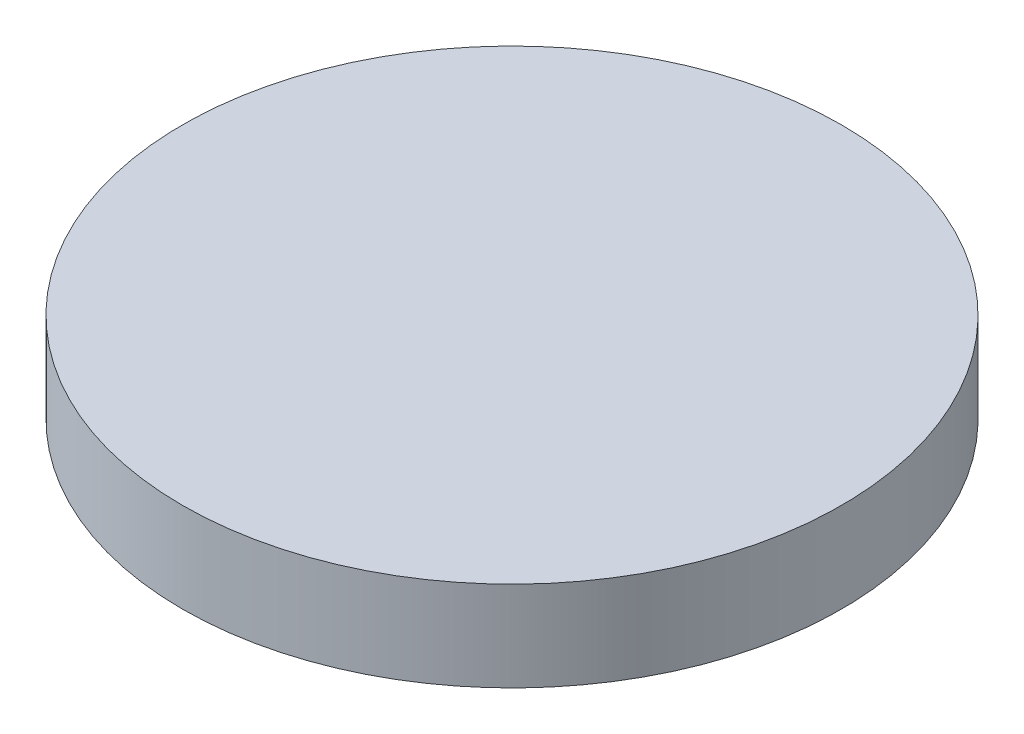
ISO-10303-21;
HEADER;
FILE_DESCRIPTION(('STEP AP214'),'2;1');
FILE_NAME('part.step','',(''),(''),'','','');
FILE_SCHEMA(('AUTOMOTIVE_DESIGN { 1 0 10303 214 1 1 1 1 }'));
ENDSEC;
DATA;
#1=APPLICATION_CONTEXT('core data for automotive mechanical design processes');
#2=APPLICATION_PROTOCOL_DEFINITION('international standard','automotive_design',2000,#1);
#3=PRODUCT_CONTEXT('',#1,'mechanical');
#4=PRODUCT('Part','Part','',(#3));
#5=PRODUCT_RELATED_PRODUCT_CATEGORY('part','',(#4));
#6=PRODUCT_DEFINITION_FORMATION('','',#4);
#7=PRODUCT_DEFINITION_CONTEXT('part definition',#1,'design');
#8=PRODUCT_DEFINITION('design','',#6,#7);
#9=PRODUCT_DEFINITION_SHAPE('','',#8);
#10=(LENGTH_UNIT() NAMED_UNIT(*) SI_UNIT(.MILLI.,.METRE.));
#11=(NAMED_UNIT(*) PLANE_ANGLE_UNIT() SI_UNIT($,.RADIAN.));
#12=(NAMED_UNIT(*) SI_UNIT($,.STERADIAN.) SOLID_ANGLE_UNIT());
#13=UNCERTAINTY_MEASURE_WITH_UNIT(LENGTH_MEASURE(1.E-05),#10,'distance_accuracy_value','');
#14=(GEOMETRIC_REPRESENTATION_CONTEXT(3) GLOBAL_UNCERTAINTY_ASSIGNED_CONTEXT((#13)) GLOBAL_UNIT_ASSIGNED_CONTEXT((#10,
#11,#12)) REPRESENTATION_CONTEXT('',''));
#15=CARTESIAN_POINT('',(0.,0.,0.));
#16=DIRECTION('',(0.,0.,1.));
#17=DIRECTION('',(1.,0.,0.));
#18=AXIS2_PLACEMENT_3D('',#15,#16,#17);
#19=CARTESIAN_POINT('',(0.,19.05,0.));
#20=DIRECTION('',(0.,-1.,0.));
#21=DIRECTION('',(0.,0.,-1.));
#22=AXIS2_PLACEMENT_3D('',#19,#20,#21);
#23=CYLINDRICAL_SURFACE('',#22,69.85);
#24=CARTESIAN_POINT('',(0.,19.05,0.));
#25=DIRECTION('',(0.,1.,0.));
#26=DIRECTION('',(0.,0.,1.));
#27=AXIS2_PLACEMENT_3D('',#24,#25,#26);
#28=CIRCLE('',#27,69.85);
#29=CARTESIAN_POINT('',(0.,19.05,-69.85));
#30=VERTEX_POINT('',#29);
#31=EDGE_CURVE('E10',#30,#30,#28,.T.);
#32=CARTESIAN_POINT('',(0.,0.,0.));
#33=DIRECTION('',(0.,1.,0.));
#34=DIRECTION('',(0.,0.,1.));
#35=AXIS2_PLACEMENT_3D('',#32,#33,#34);
#36=CIRCLE('',#35,69.85);
#37=CARTESIAN_POINT('',(0.,0.,-69.85));
#38=VERTEX_POINT('',#37);
#39=EDGE_CURVE('E36',#38,#38,#36,.T.);
#40=CARTESIAN_POINT('',(0.,19.05,-69.85));
#41=CARTESIAN_POINT('',(0.,18.8515625,-69.85));
#42=CARTESIAN_POINT('',(0.,18.653125,-69.85));
#43=CARTESIAN_POINT('',(0.,18.25625,-69.85));
#44=CARTESIAN_POINT('',(0.,18.0578125,-69.85));
#45=CARTESIAN_POINT('',(0.,17.6609375,-69.85));
#46=CARTESIAN_POINT('',(0.,17.4625,-69.85));
#47=CARTESIAN_POINT('',(0.,17.065625,-69.85));
#48=CARTESIAN_POINT('',(0.,16.8671875,-69.85));
#49=CARTESIAN_POINT('',(0.,16.4703125,-69.85));
#50=CARTESIAN_POINT('',(0.,16.271875,-69.85));
#51=CARTESIAN_POINT('',(0.,15.875,-69.85));
#52=CARTESIAN_POINT('',(0.,15.6765625,-69.85));
#53=CARTESIAN_POINT('',(0.,15.2796875,-69.85));
#54=CARTESIAN_POINT('',(0.,15.08125,-69.85));
#55=CARTESIAN_POINT('',(0.,14.684375,-69.85));
#56=CARTESIAN_POINT('',(0.,14.4859375,-69.85));
#57=CARTESIAN_POINT('',(0.,14.0890625,-69.85));
#58=CARTESIAN_POINT('',(0.,13.890625,-69.85));
#59=CARTESIAN_POINT('',(0.,13.49375,-69.85));
#60=CARTESIAN_POINT('',(0.,13.2953125,-69.85));
#61=CARTESIAN_POINT('',(0.,12.8984375,-69.85));
#62=CARTESIAN_POINT('',(0.,12.7,-69.85));
#63=CARTESIAN_POINT('',(0.,12.303125,-69.85));
#64=CARTESIAN_POINT('',(0.,12.1046875,-69.85));
#65=CARTESIAN_POINT('',(0.,11.7078125,-69.85));
#66=CARTESIAN_POINT('',(0.,11.509375,-69.85));
#67=CARTESIAN_POINT('',(0.,11.1125,-69.85));
#68=CARTESIAN_POINT('',(0.,10.9140625,-69.85));
#69=CARTESIAN_POINT('',(0.,10.5171875,-69.85));
#70=CARTESIAN_POINT('',(0.,10.31875,-69.85));
#71=CARTESIAN_POINT('',(0.,9.921875,-69.85));
#72=CARTESIAN_POINT('',(0.,9.7234375,-69.85));
#73=CARTESIAN_POINT('',(0.,9.3265625,-69.85));
#74=CARTESIAN_POINT('',(0.,9.128125,-69.85));
#75=CARTESIAN_POINT('',(0.,8.73125,-69.85));
#76=CARTESIAN_POINT('',(0.,8.5328125,-69.85));
#77=CARTESIAN_POINT('',(0.,8.1359375,-69.85));
#78=CARTESIAN_POINT('',(0.,7.9375,-69.85));
#79=CARTESIAN_POINT('',(0.,7.540625,-69.85));
#80=CARTESIAN_POINT('',(0.,7.3421875,-69.85));
#81=CARTESIAN_POINT('',(0.,6.9453125,-69.85));
#82=CARTESIAN_POINT('',(0.,6.746875,-69.85));
#83=CARTESIAN_POINT('',(0.,6.35,-69.85));
#84=CARTESIAN_POINT('',(0.,6.1515625,-69.85));
#85=CARTESIAN_POINT('',(0.,5.7546875,-69.85));
#86=CARTESIAN_POINT('',(0.,5.55625,-69.85));
#87=CARTESIAN_POINT('',(0.,5.159375,-69.85));
#88=CARTESIAN_POINT('',(0.,4.9609375,-69.85));
#89=CARTESIAN_POINT('',(0.,4.5640625,-69.85));
#90=CARTESIAN_POINT('',(0.,4.365625,-69.85));
#91=CARTESIAN_POINT('',(0.,3.96875,-69.85));
#92=CARTESIAN_POINT('',(0.,3.7703125,-69.85));
#93=CARTESIAN_POINT('',(0.,3.3734375,-69.85));
#94=CARTESIAN_POINT('',(0.,3.175,-69.85));
#95=CARTESIAN_POINT('',(0.,2.778125,-69.85));
#96=CARTESIAN_POINT('',(0.,2.5796875,-69.85));
#97=CARTESIAN_POINT('',(0.,2.1828125,-69.85));
#98=CARTESIAN_POINT('',(0.,1.984375,-69.85));
#99=CARTESIAN_POINT('',(0.,1.5875,-69.85));
#100=CARTESIAN_POINT('',(0.,1.3890625,-69.85));
#101=CARTESIAN_POINT('',(0.,0.992187500000001,-69.85));
#102=CARTESIAN_POINT('',(0.,0.793750000000001,-69.85));
#103=CARTESIAN_POINT('',(0.,0.396875,-69.85));
#104=CARTESIAN_POINT('',(0.,0.1984375,-69.85));
#105=CARTESIAN_POINT('',(0.,0.,-69.85));
#106=B_SPLINE_CURVE_WITH_KNOTS('',3,(#40,#41,#42,#43,#44,#45,#46,#47,#48,#49,#50,#51,#52,#53,
#54,#55,#56,#57,#58,#59,#60,#61,#62,#63,#64,#65,#66,#67,#68,#69,#70,#71,#72,#73,#74,#75,#76,#77,
#78,#79,#80,#81,#82,#83,#84,#85,#86,#87,#88,#89,#90,#91,#92,#93,#94,#95,#96,#97,#98,#99,#100,
#101,#102,#103,#104,#105),.UNSPECIFIED.,.F.,.F.,(4,2,2,2,2,2,2,2,2,2,2,2,2,2,2,2,2,2,2,2,2,2,2,
2,2,2,2,2,2,2,2,2,4),(0.,0.5953125,1.190625,1.7859375,2.38125,2.9765625,3.571875,4.1671875,
4.7625,5.3578125,5.953125,6.5484375,7.14375,7.7390625,8.334375,8.9296875,9.525,10.1203125,
10.715625,11.3109375,11.90625,12.5015625,13.096875,13.6921875,14.2875,14.8828125,15.478125,
16.0734375,16.66875,17.2640625,17.859375,18.4546875,19.05),.UNSPECIFIED.);
#107=EDGE_CURVE('BSEAM33',#30,#38,#106,.T.);
#108=ORIENTED_EDGE('',*,*,#31,.F.);
#109=ORIENTED_EDGE('',*,*,#39,.T.);
#110=ORIENTED_EDGE('',*,*,#107,.T.);
#111=ORIENTED_EDGE('',*,*,#107,.F.);
#112=EDGE_LOOP('',(#108,#110,#109,#111));
#113=FACE_BOUND('',#112,.T.);
#114=ADVANCED_FACE('F33',(#113),#23,.T.);
#115=CARTESIAN_POINT('',(0.,19.05,0.));
#116=DIRECTION('',(0.,1.,0.));
#117=DIRECTION('',(0.,0.,1.));
#118=AXIS2_PLACEMENT_3D('',#115,#116,#117);
#119=PLANE('',#118);
#120=ORIENTED_EDGE('',*,*,#31,.T.);
#121=EDGE_LOOP('',(#120));
#122=FACE_BOUND('',#121,.T.);
#123=ADVANCED_FACE('F54',(#122),#119,.T.);
#124=CARTESIAN_POINT('',(0.,0.,0.));
#125=DIRECTION('',(0.,1.,0.));
#126=DIRECTION('',(0.,0.,1.));
#127=AXIS2_PLACEMENT_3D('',#124,#125,#126);
#128=PLANE('',#127);
#129=ORIENTED_EDGE('',*,*,#39,.F.);
#130=EDGE_LOOP('',(#129));
#131=FACE_BOUND('',#130,.T.);
#132=ADVANCED_FACE('F52',(#131),#128,.F.);
#133=CLOSED_SHELL('',(#114,#123,#132));
#134=MANIFOLD_SOLID_BREP('B2',#133);
#135=ADVANCED_BREP_SHAPE_REPRESENTATION('',(#18,#134),#14);
#136=SHAPE_DEFINITION_REPRESENTATION(#9,#135);
ENDSEC;
END-ISO-10303-21;
